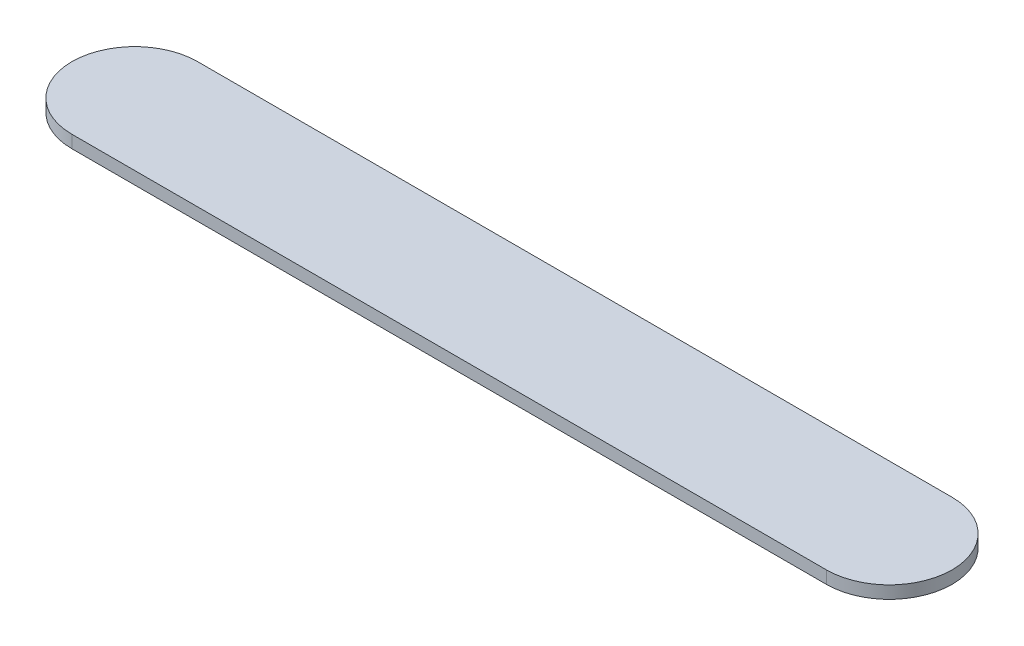
ISO-10303-21;
HEADER;
FILE_DESCRIPTION(('STEP AP214'),'2;1');
FILE_NAME('part.step','',(''),(''),'','','');
FILE_SCHEMA(('AUTOMOTIVE_DESIGN { 1 0 10303 214 1 1 1 1 }'));
ENDSEC;
DATA;
#1=APPLICATION_CONTEXT('core data for automotive mechanical design processes');
#2=APPLICATION_PROTOCOL_DEFINITION('international standard','automotive_design',2000,#1);
#3=PRODUCT_CONTEXT('',#1,'mechanical');
#4=PRODUCT('Part','Part','',(#3));
#5=PRODUCT_RELATED_PRODUCT_CATEGORY('part','',(#4));
#6=PRODUCT_DEFINITION_FORMATION('','',#4);
#7=PRODUCT_DEFINITION_CONTEXT('part definition',#1,'design');
#8=PRODUCT_DEFINITION('design','',#6,#7);
#9=PRODUCT_DEFINITION_SHAPE('','',#8);
#10=(LENGTH_UNIT() NAMED_UNIT(*) SI_UNIT(.MILLI.,.METRE.));
#11=(NAMED_UNIT(*) PLANE_ANGLE_UNIT() SI_UNIT($,.RADIAN.));
#12=(NAMED_UNIT(*) SI_UNIT($,.STERADIAN.) SOLID_ANGLE_UNIT());
#13=UNCERTAINTY_MEASURE_WITH_UNIT(LENGTH_MEASURE(1.E-05),#10,'distance_accuracy_value','');
#14=(GEOMETRIC_REPRESENTATION_CONTEXT(3) GLOBAL_UNCERTAINTY_ASSIGNED_CONTEXT((#13)) GLOBAL_UNIT_ASSIGNED_CONTEXT((#10,
#11,#12)) REPRESENTATION_CONTEXT('',''));
#15=CARTESIAN_POINT('',(0.,0.,0.));
#16=DIRECTION('',(0.,0.,1.));
#17=DIRECTION('',(1.,0.,0.));
#18=AXIS2_PLACEMENT_3D('',#15,#16,#17);
#19=CARTESIAN_POINT('',(-47.625,1.5875,0.));
#20=DIRECTION('',(0.,-1.,0.));
#21=DIRECTION('',(0.,0.,-1.));
#22=AXIS2_PLACEMENT_3D('',#19,#20,#21);
#23=CYLINDRICAL_SURFACE('',#22,7.9375);
#24=CARTESIAN_POINT('',(-47.625,0.,0.));
#25=DIRECTION('',(0.,1.,0.));
#26=DIRECTION('',(0.,0.,1.));
#27=AXIS2_PLACEMENT_3D('',#24,#25,#26);
#28=CIRCLE('',#27,7.9375);
#29=CARTESIAN_POINT('',(-47.625,0.,-7.9375));
#30=VERTEX_POINT('',#29);
#31=CARTESIAN_POINT('',(-47.625,0.,7.9375));
#32=VERTEX_POINT('',#31);
#33=EDGE_CURVE('E100',#30,#32,#28,.T.);
#34=ORIENTED_EDGE('',*,*,#33,.T.);
#35=DIRECTION('',(0.,-1.,0.));
#36=VECTOR('',#35,1.);
#37=CARTESIAN_POINT('',(-47.625,1.5875,7.9375));
#38=LINE('',#37,#36);
#39=CARTESIAN_POINT('',(-47.625,1.5875,7.9375));
#40=VERTEX_POINT('',#39);
#41=EDGE_CURVE('E11',#40,#32,#38,.T.);
#42=ORIENTED_EDGE('',*,*,#41,.F.);
#43=CARTESIAN_POINT('',(-47.625,1.5875,0.));
#44=DIRECTION('',(0.,1.,0.));
#45=DIRECTION('',(0.,0.,1.));
#46=AXIS2_PLACEMENT_3D('',#43,#44,#45);
#47=CIRCLE('',#46,7.9375);
#48=CARTESIAN_POINT('',(-47.625,1.5875,-7.9375));
#49=VERTEX_POINT('',#48);
#50=EDGE_CURVE('E88',#49,#40,#47,.T.);
#51=ORIENTED_EDGE('',*,*,#50,.F.);
#52=DIRECTION('',(0.,-1.,0.));
#53=VECTOR('',#52,1.);
#54=CARTESIAN_POINT('',(-47.625,1.5875,-7.9375));
#55=LINE('',#54,#53);
#56=EDGE_CURVE('E96',#49,#30,#55,.T.);
#57=ORIENTED_EDGE('',*,*,#56,.T.);
#58=EDGE_LOOP('',(#34,#42,#51,#57));
#59=FACE_BOUND('',#58,.T.);
#60=ADVANCED_FACE('F37',(#59),#23,.T.);
#61=CARTESIAN_POINT('',(-47.625,1.5875,7.9375));
#62=DIRECTION('',(0.,0.,-1.));
#63=DIRECTION('',(-1.,0.,0.));
#64=AXIS2_PLACEMENT_3D('',#61,#62,#63);
#65=PLANE('',#64);
#66=DIRECTION('',(1.,0.,0.));
#67=VECTOR('',#66,1.);
#68=CARTESIAN_POINT('',(-47.625,0.,7.9375));
#69=LINE('',#68,#67);
#70=CARTESIAN_POINT('',(47.625,0.,7.9375));
#71=VERTEX_POINT('',#70);
#72=EDGE_CURVE('E92',#32,#71,#69,.T.);
#73=ORIENTED_EDGE('',*,*,#72,.T.);
#74=DIRECTION('',(0.,-1.,0.));
#75=VECTOR('',#74,1.);
#76=CARTESIAN_POINT('',(47.625,1.5875,7.9375));
#77=LINE('',#76,#75);
#78=CARTESIAN_POINT('',(47.625,1.5875,7.9375));
#79=VERTEX_POINT('',#78);
#80=EDGE_CURVE('E45',#79,#71,#77,.T.);
#81=ORIENTED_EDGE('',*,*,#80,.F.);
#82=DIRECTION('',(1.,0.,0.));
#83=VECTOR('',#82,1.);
#84=CARTESIAN_POINT('',(-47.625,1.5875,7.9375));
#85=LINE('',#84,#83);
#86=EDGE_CURVE('E83',#40,#79,#85,.T.);
#87=ORIENTED_EDGE('',*,*,#86,.F.);
#88=ORIENTED_EDGE('',*,*,#41,.T.);
#89=EDGE_LOOP('',(#73,#81,#87,#88));
#90=FACE_BOUND('',#89,.T.);
#91=ADVANCED_FACE('F91',(#90),#65,.F.);
#92=CARTESIAN_POINT('',(47.625,1.5875,0.));
#93=DIRECTION('',(0.,-1.,0.));
#94=DIRECTION('',(0.,0.,-1.));
#95=AXIS2_PLACEMENT_3D('',#92,#93,#94);
#96=CYLINDRICAL_SURFACE('',#95,7.9375);
#97=CARTESIAN_POINT('',(47.625,0.,0.));
#98=DIRECTION('',(0.,1.,0.));
#99=DIRECTION('',(0.,0.,1.));
#100=AXIS2_PLACEMENT_3D('',#97,#98,#99);
#101=CIRCLE('',#100,7.9375);
#102=CARTESIAN_POINT('',(47.625,0.,-7.9375));
#103=VERTEX_POINT('',#102);
#104=EDGE_CURVE('E70',#71,#103,#101,.T.);
#105=ORIENTED_EDGE('',*,*,#104,.T.);
#106=DIRECTION('',(0.,-1.,0.));
#107=VECTOR('',#106,1.);
#108=CARTESIAN_POINT('',(47.625,1.5875,-7.9375));
#109=LINE('',#108,#107);
#110=CARTESIAN_POINT('',(47.625,1.5875,-7.9375));
#111=VERTEX_POINT('',#110);
#112=EDGE_CURVE('E93',#111,#103,#109,.T.);
#113=ORIENTED_EDGE('',*,*,#112,.F.);
#114=CARTESIAN_POINT('',(47.625,1.5875,0.));
#115=DIRECTION('',(0.,1.,0.));
#116=DIRECTION('',(0.,0.,1.));
#117=AXIS2_PLACEMENT_3D('',#114,#115,#116);
#118=CIRCLE('',#117,7.9375);
#119=EDGE_CURVE('E86',#79,#111,#118,.T.);
#120=ORIENTED_EDGE('',*,*,#119,.F.);
#121=ORIENTED_EDGE('',*,*,#80,.T.);
#122=EDGE_LOOP('',(#105,#113,#120,#121));
#123=FACE_BOUND('',#122,.T.);
#124=ADVANCED_FACE('F94',(#123),#96,.T.);
#125=CARTESIAN_POINT('',(-47.625,1.5875,-7.9375));
#126=DIRECTION('',(0.,0.,1.));
#127=DIRECTION('',(1.,0.,0.));
#128=AXIS2_PLACEMENT_3D('',#125,#126,#127);
#129=PLANE('',#128);
#130=DIRECTION('',(-1.,0.,0.));
#131=VECTOR('',#130,1.);
#132=CARTESIAN_POINT('',(-47.625,0.,-7.9375));
#133=LINE('',#132,#131);
#134=EDGE_CURVE('E76',#103,#30,#133,.T.);
#135=ORIENTED_EDGE('',*,*,#134,.T.);
#136=ORIENTED_EDGE('',*,*,#56,.F.);
#137=DIRECTION('',(-1.,0.,0.));
#138=VECTOR('',#137,1.);
#139=CARTESIAN_POINT('',(-47.625,1.5875,-7.9375));
#140=LINE('',#139,#138);
#141=EDGE_CURVE('E53',#111,#49,#140,.T.);
#142=ORIENTED_EDGE('',*,*,#141,.F.);
#143=ORIENTED_EDGE('',*,*,#112,.T.);
#144=EDGE_LOOP('',(#135,#136,#142,#143));
#145=FACE_BOUND('',#144,.T.);
#146=ADVANCED_FACE('F107',(#145),#129,.F.);
#147=CARTESIAN_POINT('',(-47.625,1.5875,0.));
#148=DIRECTION('',(0.,1.,0.));
#149=DIRECTION('',(0.,0.,1.));
#150=AXIS2_PLACEMENT_3D('',#147,#148,#149);
#151=PLANE('',#150);
#152=ORIENTED_EDGE('',*,*,#50,.T.);
#153=ORIENTED_EDGE('',*,*,#86,.T.);
#154=ORIENTED_EDGE('',*,*,#119,.T.);
#155=ORIENTED_EDGE('',*,*,#141,.T.);
#156=EDGE_LOOP('',(#152,#153,#154,#155));
#157=FACE_BOUND('',#156,.T.);
#158=ADVANCED_FACE('F84',(#157),#151,.T.);
#159=CARTESIAN_POINT('',(-47.625,0.,0.));
#160=DIRECTION('',(0.,1.,0.));
#161=DIRECTION('',(0.,0.,1.));
#162=AXIS2_PLACEMENT_3D('',#159,#160,#161);
#163=PLANE('',#162);
#164=ORIENTED_EDGE('',*,*,#33,.F.);
#165=ORIENTED_EDGE('',*,*,#134,.F.);
#166=ORIENTED_EDGE('',*,*,#104,.F.);
#167=ORIENTED_EDGE('',*,*,#72,.F.);
#168=EDGE_LOOP('',(#164,#165,#166,#167));
#169=FACE_BOUND('',#168,.T.);
#170=ADVANCED_FACE('F110',(#169),#163,.F.);
#171=CLOSED_SHELL('',(#60,#91,#124,#146,#158,#170));
#172=MANIFOLD_SOLID_BREP('B2',#171);
#173=ADVANCED_BREP_SHAPE_REPRESENTATION('',(#18,#172),#14);
#174=SHAPE_DEFINITION_REPRESENTATION(#9,#173);
ENDSEC;
END-ISO-10303-21;
